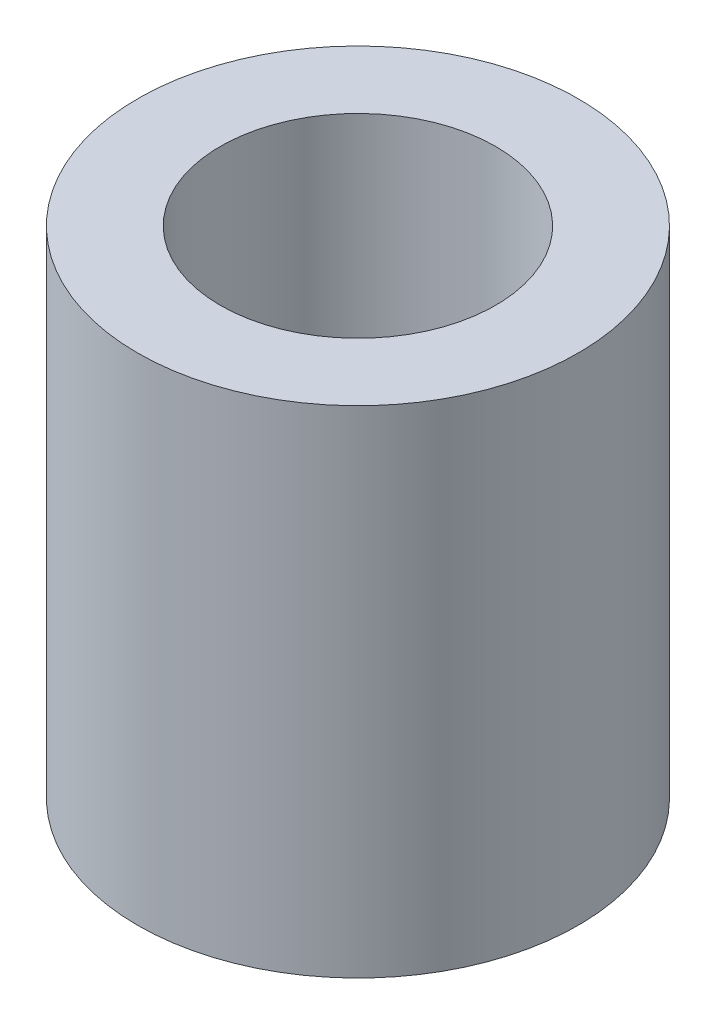
ISO-10303-21;
HEADER;
FILE_DESCRIPTION(('STEP AP214'),'2;1');
FILE_NAME('part.step','',(''),(''),'','','');
FILE_SCHEMA(('AUTOMOTIVE_DESIGN { 1 0 10303 214 1 1 1 1 }'));
ENDSEC;
DATA;
#1=APPLICATION_CONTEXT('core data for automotive mechanical design processes');
#2=APPLICATION_PROTOCOL_DEFINITION('international standard','automotive_design',2000,#1);
#3=PRODUCT_CONTEXT('',#1,'mechanical');
#4=PRODUCT('Part','Part','',(#3));
#5=PRODUCT_RELATED_PRODUCT_CATEGORY('part','',(#4));
#6=PRODUCT_DEFINITION_FORMATION('','',#4);
#7=PRODUCT_DEFINITION_CONTEXT('part definition',#1,'design');
#8=PRODUCT_DEFINITION('design','',#6,#7);
#9=PRODUCT_DEFINITION_SHAPE('','',#8);
#10=(LENGTH_UNIT() NAMED_UNIT(*) SI_UNIT(.MILLI.,.METRE.));
#11=(NAMED_UNIT(*) PLANE_ANGLE_UNIT() SI_UNIT($,.RADIAN.));
#12=(NAMED_UNIT(*) SI_UNIT($,.STERADIAN.) SOLID_ANGLE_UNIT());
#13=UNCERTAINTY_MEASURE_WITH_UNIT(LENGTH_MEASURE(1.E-05),#10,'distance_accuracy_value','');
#14=(GEOMETRIC_REPRESENTATION_CONTEXT(3) GLOBAL_UNCERTAINTY_ASSIGNED_CONTEXT((#13)) GLOBAL_UNIT_ASSIGNED_CONTEXT((#10,
#11,#12)) REPRESENTATION_CONTEXT('',''));
#15=CARTESIAN_POINT('',(0.,0.,0.));
#16=DIRECTION('',(0.,0.,1.));
#17=DIRECTION('',(1.,0.,0.));
#18=AXIS2_PLACEMENT_3D('',#15,#16,#17);
#19=CARTESIAN_POINT('',(0.,4.5,0.));
#20=DIRECTION('',(0.,1.,0.));
#21=DIRECTION('',(0.,0.,1.));
#22=AXIS2_PLACEMENT_3D('',#19,#20,#21);
#23=PLANE('',#22);
#24=CARTESIAN_POINT('',(0.,4.5,0.));
#25=DIRECTION('',(0.,1.,0.));
#26=DIRECTION('',(0.,0.,1.));
#27=AXIS2_PLACEMENT_3D('',#24,#25,#26);
#28=CIRCLE('',#27,4.);
#29=CARTESIAN_POINT('',(0.,4.5,4.));
#30=VERTEX_POINT('',#29);
#31=EDGE_CURVE('E10',#30,#30,#28,.T.);
#32=ORIENTED_EDGE('',*,*,#31,.T.);
#33=EDGE_LOOP('',(#32));
#34=FACE_BOUND('',#33,.T.);
#35=CARTESIAN_POINT('',(0.,4.5,0.));
#36=DIRECTION('',(0.,1.,0.));
#37=DIRECTION('',(0.,0.,1.));
#38=AXIS2_PLACEMENT_3D('',#35,#36,#37);
#39=CIRCLE('',#38,2.5);
#40=CARTESIAN_POINT('',(0.,4.5,2.5));
#41=VERTEX_POINT('',#40);
#42=EDGE_CURVE('E28',#41,#41,#39,.T.);
#43=ORIENTED_EDGE('',*,*,#42,.F.);
#44=EDGE_LOOP('',(#43));
#45=FACE_BOUND('',#44,.T.);
#46=ADVANCED_FACE('F14',(#34,#45),#23,.T.);
#47=CARTESIAN_POINT('',(0.,-4.5,0.));
#48=DIRECTION('',(0.,1.,0.));
#49=DIRECTION('',(0.,0.,1.));
#50=AXIS2_PLACEMENT_3D('',#47,#48,#49);
#51=PLANE('',#50);
#52=CARTESIAN_POINT('',(0.,-4.5,0.));
#53=DIRECTION('',(0.,1.,0.));
#54=DIRECTION('',(0.,0.,1.));
#55=AXIS2_PLACEMENT_3D('',#52,#53,#54);
#56=CIRCLE('',#55,4.);
#57=CARTESIAN_POINT('',(0.,-4.5,4.));
#58=VERTEX_POINT('',#57);
#59=EDGE_CURVE('E18',#58,#58,#56,.T.);
#60=ORIENTED_EDGE('',*,*,#59,.F.);
#61=EDGE_LOOP('',(#60));
#62=FACE_BOUND('',#61,.T.);
#63=CARTESIAN_POINT('',(0.,-4.5,0.));
#64=DIRECTION('',(0.,1.,0.));
#65=DIRECTION('',(0.,0.,1.));
#66=AXIS2_PLACEMENT_3D('',#63,#64,#65);
#67=CIRCLE('',#66,2.5);
#68=CARTESIAN_POINT('',(0.,-4.5,2.5));
#69=VERTEX_POINT('',#68);
#70=EDGE_CURVE('E30',#69,#69,#67,.T.);
#71=ORIENTED_EDGE('',*,*,#70,.T.);
#72=EDGE_LOOP('',(#71));
#73=FACE_BOUND('',#72,.T.);
#74=ADVANCED_FACE('F42',(#62,#73),#51,.F.);
#75=CARTESIAN_POINT('',(0.,4.5,0.));
#76=DIRECTION('',(0.,-1.,0.));
#77=DIRECTION('',(0.,0.,-1.));
#78=AXIS2_PLACEMENT_3D('',#75,#76,#77);
#79=CYLINDRICAL_SURFACE('',#78,4.);
#80=ORIENTED_EDGE('',*,*,#31,.F.);
#81=EDGE_LOOP('',(#80));
#82=FACE_BOUND('',#81,.T.);
#83=ORIENTED_EDGE('',*,*,#59,.T.);
#84=EDGE_LOOP('',(#83));
#85=FACE_BOUND('',#84,.T.);
#86=ADVANCED_FACE('F16',(#82,#85),#79,.T.);
#87=CARTESIAN_POINT('',(0.,4.5,0.));
#88=DIRECTION('',(0.,-1.,0.));
#89=DIRECTION('',(0.,0.,-1.));
#90=AXIS2_PLACEMENT_3D('',#87,#88,#89);
#91=CYLINDRICAL_SURFACE('',#90,2.5);
#92=ORIENTED_EDGE('',*,*,#42,.T.);
#93=EDGE_LOOP('',(#92));
#94=FACE_BOUND('',#93,.T.);
#95=ORIENTED_EDGE('',*,*,#70,.F.);
#96=EDGE_LOOP('',(#95));
#97=FACE_BOUND('',#96,.T.);
#98=ADVANCED_FACE('F38',(#94,#97),#91,.F.);
#99=CLOSED_SHELL('',(#46,#74,#86,#98));
#100=MANIFOLD_SOLID_BREP('B1',#99);
#101=ADVANCED_BREP_SHAPE_REPRESENTATION('',(#18,#100),#14);
#102=SHAPE_DEFINITION_REPRESENTATION(#9,#101);
ENDSEC;
END-ISO-10303-21;
